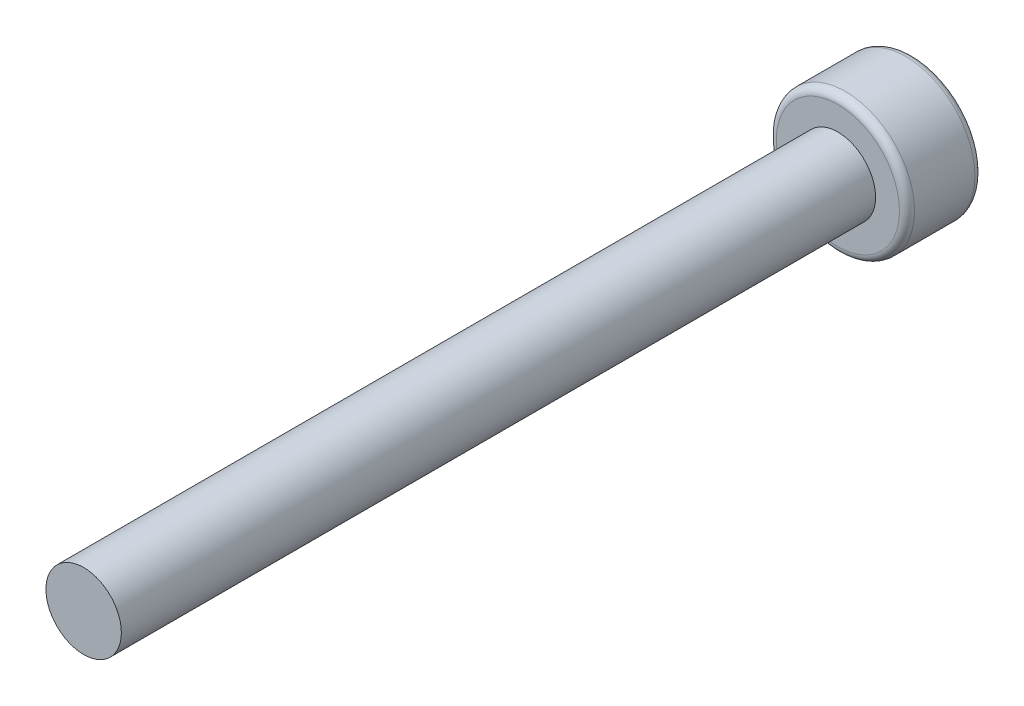
ISO-10303-21;
HEADER;
FILE_DESCRIPTION(('STEP AP214'),'2;1');
FILE_NAME('part.step','',(''),(''),'','','');
FILE_SCHEMA(('AUTOMOTIVE_DESIGN { 1 0 10303 214 1 1 1 1 }'));
ENDSEC;
DATA;
#1=APPLICATION_CONTEXT('core data for automotive mechanical design processes');
#2=APPLICATION_PROTOCOL_DEFINITION('international standard','automotive_design',2000,#1);
#3=PRODUCT_CONTEXT('',#1,'mechanical');
#4=PRODUCT('Part','Part','',(#3));
#5=PRODUCT_RELATED_PRODUCT_CATEGORY('part','',(#4));
#6=PRODUCT_DEFINITION_FORMATION('','',#4);
#7=PRODUCT_DEFINITION_CONTEXT('part definition',#1,'design');
#8=PRODUCT_DEFINITION('design','',#6,#7);
#9=PRODUCT_DEFINITION_SHAPE('','',#8);
#10=(LENGTH_UNIT() NAMED_UNIT(*) SI_UNIT(.MILLI.,.METRE.));
#11=(NAMED_UNIT(*) PLANE_ANGLE_UNIT() SI_UNIT($,.RADIAN.));
#12=(NAMED_UNIT(*) SI_UNIT($,.STERADIAN.) SOLID_ANGLE_UNIT());
#13=UNCERTAINTY_MEASURE_WITH_UNIT(LENGTH_MEASURE(1.E-05),#10,'distance_accuracy_value','');
#14=(GEOMETRIC_REPRESENTATION_CONTEXT(3) GLOBAL_UNCERTAINTY_ASSIGNED_CONTEXT((#13)) GLOBAL_UNIT_ASSIGNED_CONTEXT((#10,
#11,#12)) REPRESENTATION_CONTEXT('',''));
#15=CARTESIAN_POINT('',(0.,0.,0.));
#16=DIRECTION('',(0.,0.,1.));
#17=DIRECTION('',(1.,0.,0.));
#18=AXIS2_PLACEMENT_3D('',#15,#16,#17);
#19=CARTESIAN_POINT('',(0.,0.,3.));
#20=DIRECTION('',(0.,0.,-1.));
#21=DIRECTION('',(-1.,0.,0.));
#22=AXIS2_PLACEMENT_3D('',#19,#20,#21);
#23=CYLINDRICAL_SURFACE('',#22,2.75);
#24=CARTESIAN_POINT('',(0.,0.,0.3));
#25=DIRECTION('',(0.,0.,1.));
#26=DIRECTION('',(1.,0.,0.));
#27=AXIS2_PLACEMENT_3D('',#24,#25,#26);
#28=CIRCLE('',#27,2.75);
#29=CARTESIAN_POINT('',(2.75,0.,0.3));
#30=VERTEX_POINT('',#29);
#31=EDGE_CURVE('E155',#30,#30,#28,.T.);
#32=ORIENTED_EDGE('',*,*,#31,.T.);
#33=EDGE_LOOP('',(#32));
#34=FACE_BOUND('',#33,.T.);
#35=CARTESIAN_POINT('',(0.,0.,2.7));
#36=DIRECTION('',(0.,0.,1.));
#37=DIRECTION('',(1.,0.,0.));
#38=AXIS2_PLACEMENT_3D('',#35,#36,#37);
#39=CIRCLE('',#38,2.75);
#40=CARTESIAN_POINT('',(2.75,0.,2.7));
#41=VERTEX_POINT('',#40);
#42=EDGE_CURVE('E152',#41,#41,#39,.F.);
#43=ORIENTED_EDGE('',*,*,#42,.T.);
#44=EDGE_LOOP('',(#43));
#45=FACE_BOUND('',#44,.T.);
#46=ADVANCED_FACE('F39',(#34,#45),#23,.T.);
#47=CARTESIAN_POINT('',(0.,0.,3.));
#48=DIRECTION('',(0.,0.,1.));
#49=DIRECTION('',(1.,0.,0.));
#50=AXIS2_PLACEMENT_3D('',#47,#48,#49);
#51=PLANE('',#50);
#52=CARTESIAN_POINT('',(0.,0.,3.));
#53=DIRECTION('',(0.,0.,1.));
#54=DIRECTION('',(1.,0.,0.));
#55=AXIS2_PLACEMENT_3D('',#52,#53,#54);
#56=CIRCLE('',#55,2.45);
#57=CARTESIAN_POINT('',(2.45,0.,3.));
#58=VERTEX_POINT('',#57);
#59=EDGE_CURVE('E11',#58,#58,#56,.T.);
#60=ORIENTED_EDGE('',*,*,#59,.T.);
#61=EDGE_LOOP('',(#60));
#62=FACE_BOUND('',#61,.T.);
#63=CARTESIAN_POINT('',(0.,0.,3.));
#64=DIRECTION('',(0.,0.,1.));
#65=DIRECTION('',(1.,0.,0.));
#66=AXIS2_PLACEMENT_3D('',#63,#64,#65);
#67=CIRCLE('',#66,1.5);
#68=CARTESIAN_POINT('',(1.5,0.,3.));
#69=VERTEX_POINT('',#68);
#70=EDGE_CURVE('E149',#69,#69,#67,.T.);
#71=ORIENTED_EDGE('',*,*,#70,.F.);
#72=EDGE_LOOP('',(#71));
#73=FACE_BOUND('',#72,.T.);
#74=ADVANCED_FACE('F170',(#62,#73),#51,.T.);
#75=CARTESIAN_POINT('',(0.,0.,0.));
#76=DIRECTION('',(0.,0.,1.));
#77=DIRECTION('',(1.,0.,0.));
#78=AXIS2_PLACEMENT_3D('',#75,#76,#77);
#79=PLANE('',#78);
#80=DIRECTION('',(0.590811113127551,-0.806809908593706,0.));
#81=VECTOR('',#80,1.);
#82=CARTESIAN_POINT('',(0.820853493075304,1.8624081611757,0.));
#83=LINE('',#82,#81);
#84=CARTESIAN_POINT('',(0.820853493075304,1.8624081611757,0.));
#85=VERTEX_POINT('',#84);
#86=CARTESIAN_POINT('',(2.02331952633127,0.220324102799441,0.));
#87=VERTEX_POINT('',#86);
#88=EDGE_CURVE('E128',#85,#87,#83,.T.);
#89=ORIENTED_EDGE('',*,*,#88,.F.);
#90=DIRECTION('',(0.994123433430926,0.108252478509768,0.));
#91=VECTOR('',#90,1.);
#92=CARTESIAN_POINT('',(-1.20246603325596,1.64208405837626,0.));
#93=LINE('',#92,#91);
#94=CARTESIAN_POINT('',(-1.20246603325596,1.64208405837626,0.));
#95=VERTEX_POINT('',#94);
#96=EDGE_CURVE('E54',#95,#85,#93,.T.);
#97=ORIENTED_EDGE('',*,*,#96,.F.);
#98=DIRECTION('',(0.403312320303375,0.915062387103474,0.));
#99=VECTOR('',#98,1.);
#100=CARTESIAN_POINT('',(-2.02331952633127,-0.220324102799442,0.));
#101=LINE('',#100,#99);
#102=CARTESIAN_POINT('',(-2.02331952633127,-0.220324102799442,0.));
#103=VERTEX_POINT('',#102);
#104=EDGE_CURVE('E137',#103,#95,#101,.T.);
#105=ORIENTED_EDGE('',*,*,#104,.F.);
#106=DIRECTION('',(-0.590811113127551,0.806809908593706,0.));
#107=VECTOR('',#106,1.);
#108=CARTESIAN_POINT('',(-0.820853493075303,-1.8624081611757,0.));
#109=LINE('',#108,#107);
#110=CARTESIAN_POINT('',(-0.820853493075303,-1.8624081611757,0.));
#111=VERTEX_POINT('',#110);
#112=EDGE_CURVE('E135',#111,#103,#109,.T.);
#113=ORIENTED_EDGE('',*,*,#112,.F.);
#114=DIRECTION('',(-0.994123433430926,-0.108252478509768,0.));
#115=VECTOR('',#114,1.);
#116=CARTESIAN_POINT('',(1.20246603325596,-1.64208405837625,0.));
#117=LINE('',#116,#115);
#118=CARTESIAN_POINT('',(1.20246603325596,-1.64208405837625,0.));
#119=VERTEX_POINT('',#118);
#120=EDGE_CURVE('E102',#119,#111,#117,.T.);
#121=ORIENTED_EDGE('',*,*,#120,.F.);
#122=DIRECTION('',(-0.403312320303375,-0.915062387103474,0.));
#123=VECTOR('',#122,1.);
#124=CARTESIAN_POINT('',(2.02331952633127,0.220324102799441,0.));
#125=LINE('',#124,#123);
#126=EDGE_CURVE('E131',#87,#119,#125,.T.);
#127=ORIENTED_EDGE('',*,*,#126,.F.);
#128=EDGE_LOOP('',(#89,#97,#105,#113,#121,#127));
#129=FACE_BOUND('',#128,.T.);
#130=CARTESIAN_POINT('',(0.,0.,0.));
#131=DIRECTION('',(0.,0.,1.));
#132=DIRECTION('',(1.,0.,0.));
#133=AXIS2_PLACEMENT_3D('',#130,#131,#132);
#134=CIRCLE('',#133,2.45);
#135=CARTESIAN_POINT('',(2.45,0.,0.));
#136=VERTEX_POINT('',#135);
#137=EDGE_CURVE('E47',#136,#136,#134,.F.);
#138=ORIENTED_EDGE('',*,*,#137,.T.);
#139=EDGE_LOOP('',(#138));
#140=FACE_BOUND('',#139,.T.);
#141=ADVANCED_FACE('F160',(#129,#140),#79,.F.);
#142=CARTESIAN_POINT('',(0.,0.,33.));
#143=DIRECTION('',(0.,0.,-1.));
#144=DIRECTION('',(-1.,0.,0.));
#145=AXIS2_PLACEMENT_3D('',#142,#143,#144);
#146=CYLINDRICAL_SURFACE('',#145,1.5);
#147=CARTESIAN_POINT('',(0.,0.,33.));
#148=DIRECTION('',(0.,0.,1.));
#149=DIRECTION('',(1.,0.,0.));
#150=AXIS2_PLACEMENT_3D('',#147,#148,#149);
#151=CIRCLE('',#150,1.5);
#152=CARTESIAN_POINT('',(1.5,0.,33.));
#153=VERTEX_POINT('',#152);
#154=EDGE_CURVE('E141',#153,#153,#151,.T.);
#155=ORIENTED_EDGE('',*,*,#154,.F.);
#156=EDGE_LOOP('',(#155));
#157=FACE_BOUND('',#156,.T.);
#158=ORIENTED_EDGE('',*,*,#70,.T.);
#159=EDGE_LOOP('',(#158));
#160=FACE_BOUND('',#159,.T.);
#161=ADVANCED_FACE('F184',(#157,#160),#146,.T.);
#162=CARTESIAN_POINT('',(0.,0.,33.));
#163=DIRECTION('',(0.,0.,1.));
#164=DIRECTION('',(1.,0.,0.));
#165=AXIS2_PLACEMENT_3D('',#162,#163,#164);
#166=PLANE('',#165);
#167=ORIENTED_EDGE('',*,*,#154,.T.);
#168=EDGE_LOOP('',(#167));
#169=FACE_BOUND('',#168,.T.);
#170=ADVANCED_FACE('F165',(#169),#166,.T.);
#171=CARTESIAN_POINT('',(0.,0.,0.3));
#172=DIRECTION('',(0.,0.,1.));
#173=DIRECTION('',(1.,0.,0.));
#174=AXIS2_PLACEMENT_3D('',#171,#172,#173);
#175=TOROIDAL_SURFACE('',#174,2.45,0.3);
#176=ORIENTED_EDGE('',*,*,#137,.F.);
#177=EDGE_LOOP('',(#176));
#178=FACE_BOUND('',#177,.T.);
#179=ORIENTED_EDGE('',*,*,#31,.F.);
#180=EDGE_LOOP('',(#179));
#181=FACE_BOUND('',#180,.T.);
#182=ADVANCED_FACE('F162',(#178,#181),#175,.T.);
#183=CARTESIAN_POINT('',(0.,0.,2.7));
#184=DIRECTION('',(0.,0.,1.));
#185=DIRECTION('',(1.,0.,0.));
#186=AXIS2_PLACEMENT_3D('',#183,#184,#185);
#187=TOROIDAL_SURFACE('',#186,2.45,0.3);
#188=ORIENTED_EDGE('',*,*,#42,.F.);
#189=EDGE_LOOP('',(#188));
#190=FACE_BOUND('',#189,.T.);
#191=ORIENTED_EDGE('',*,*,#59,.F.);
#192=EDGE_LOOP('',(#191));
#193=FACE_BOUND('',#192,.T.);
#194=ADVANCED_FACE('F41',(#190,#193),#187,.T.);
#195=CARTESIAN_POINT('',(-1.20246603325596,1.64208405837626,2.));
#196=DIRECTION('',(-0.108252478509768,0.994123433430926,0.));
#197=DIRECTION('',(-0.994123433430926,-0.108252478509768,0.));
#198=AXIS2_PLACEMENT_3D('',#195,#196,#197);
#199=PLANE('',#198);
#200=ORIENTED_EDGE('',*,*,#96,.T.);
#201=DIRECTION('',(0.,0.,-1.));
#202=VECTOR('',#201,1.);
#203=CARTESIAN_POINT('',(0.820853493075304,1.8624081611757,2.));
#204=LINE('',#203,#202);
#205=CARTESIAN_POINT('',(0.820853493075304,1.8624081611757,2.));
#206=VERTEX_POINT('',#205);
#207=EDGE_CURVE('E84',#206,#85,#204,.T.);
#208=ORIENTED_EDGE('',*,*,#207,.F.);
#209=DIRECTION('',(0.994123433430926,0.108252478509768,0.));
#210=VECTOR('',#209,1.);
#211=CARTESIAN_POINT('',(-1.20246603325596,1.64208405837626,2.));
#212=LINE('',#211,#210);
#213=CARTESIAN_POINT('',(-1.20246603325596,1.64208405837626,2.));
#214=VERTEX_POINT('',#213);
#215=EDGE_CURVE('E139',#214,#206,#212,.T.);
#216=ORIENTED_EDGE('',*,*,#215,.F.);
#217=DIRECTION('',(0.,0.,-1.));
#218=VECTOR('',#217,1.);
#219=CARTESIAN_POINT('',(-1.20246603325596,1.64208405837626,2.));
#220=LINE('',#219,#218);
#221=EDGE_CURVE('E62',#214,#95,#220,.T.);
#222=ORIENTED_EDGE('',*,*,#221,.T.);
#223=EDGE_LOOP('',(#200,#208,#216,#222));
#224=FACE_BOUND('',#223,.T.);
#225=ADVANCED_FACE('F176',(#224),#199,.F.);
#226=CARTESIAN_POINT('',(-2.02331952633127,-0.220324102799442,2.));
#227=DIRECTION('',(-0.915062387103474,0.403312320303375,0.));
#228=DIRECTION('',(-0.403312320303375,-0.915062387103474,0.));
#229=AXIS2_PLACEMENT_3D('',#226,#227,#228);
#230=PLANE('',#229);
#231=ORIENTED_EDGE('',*,*,#104,.T.);
#232=ORIENTED_EDGE('',*,*,#221,.F.);
#233=DIRECTION('',(0.403312320303375,0.915062387103474,0.));
#234=VECTOR('',#233,1.);
#235=CARTESIAN_POINT('',(-2.02331952633127,-0.220324102799442,2.));
#236=LINE('',#235,#234);
#237=CARTESIAN_POINT('',(-2.02331952633127,-0.220324102799442,2.));
#238=VERTEX_POINT('',#237);
#239=EDGE_CURVE('E114',#238,#214,#236,.T.);
#240=ORIENTED_EDGE('',*,*,#239,.F.);
#241=DIRECTION('',(0.,0.,-1.));
#242=VECTOR('',#241,1.);
#243=CARTESIAN_POINT('',(-2.02331952633127,-0.220324102799442,2.));
#244=LINE('',#243,#242);
#245=EDGE_CURVE('E106',#238,#103,#244,.T.);
#246=ORIENTED_EDGE('',*,*,#245,.T.);
#247=EDGE_LOOP('',(#231,#232,#240,#246));
#248=FACE_BOUND('',#247,.T.);
#249=ADVANCED_FACE('F200',(#248),#230,.F.);
#250=CARTESIAN_POINT('',(-0.820853493075303,-1.8624081611757,2.));
#251=DIRECTION('',(-0.806809908593706,-0.590811113127551,0.));
#252=DIRECTION('',(0.590811113127551,-0.806809908593706,0.));
#253=AXIS2_PLACEMENT_3D('',#250,#251,#252);
#254=PLANE('',#253);
#255=ORIENTED_EDGE('',*,*,#112,.T.);
#256=ORIENTED_EDGE('',*,*,#245,.F.);
#257=DIRECTION('',(-0.590811113127551,0.806809908593706,0.));
#258=VECTOR('',#257,1.);
#259=CARTESIAN_POINT('',(-0.820853493075303,-1.8624081611757,2.));
#260=LINE('',#259,#258);
#261=CARTESIAN_POINT('',(-0.820853493075303,-1.8624081611757,2.));
#262=VERTEX_POINT('',#261);
#263=EDGE_CURVE('E110',#262,#238,#260,.T.);
#264=ORIENTED_EDGE('',*,*,#263,.F.);
#265=DIRECTION('',(0.,0.,-1.));
#266=VECTOR('',#265,1.);
#267=CARTESIAN_POINT('',(-0.820853493075303,-1.8624081611757,2.));
#268=LINE('',#267,#266);
#269=EDGE_CURVE('E95',#262,#111,#268,.T.);
#270=ORIENTED_EDGE('',*,*,#269,.T.);
#271=EDGE_LOOP('',(#255,#256,#264,#270));
#272=FACE_BOUND('',#271,.T.);
#273=ADVANCED_FACE('F111',(#272),#254,.F.);
#274=CARTESIAN_POINT('',(1.20246603325596,-1.64208405837625,2.));
#275=DIRECTION('',(0.108252478509768,-0.994123433430926,0.));
#276=DIRECTION('',(0.994123433430926,0.108252478509768,0.));
#277=AXIS2_PLACEMENT_3D('',#274,#275,#276);
#278=PLANE('',#277);
#279=ORIENTED_EDGE('',*,*,#120,.T.);
#280=ORIENTED_EDGE('',*,*,#269,.F.);
#281=DIRECTION('',(-0.994123433430926,-0.108252478509768,0.));
#282=VECTOR('',#281,1.);
#283=CARTESIAN_POINT('',(1.20246603325596,-1.64208405837625,2.));
#284=LINE('',#283,#282);
#285=CARTESIAN_POINT('',(1.20246603325596,-1.64208405837625,2.));
#286=VERTEX_POINT('',#285);
#287=EDGE_CURVE('E99',#286,#262,#284,.T.);
#288=ORIENTED_EDGE('',*,*,#287,.F.);
#289=DIRECTION('',(0.,0.,-1.));
#290=VECTOR('',#289,1.);
#291=CARTESIAN_POINT('',(1.20246603325596,-1.64208405837625,2.));
#292=LINE('',#291,#290);
#293=EDGE_CURVE('E107',#286,#119,#292,.T.);
#294=ORIENTED_EDGE('',*,*,#293,.T.);
#295=EDGE_LOOP('',(#279,#280,#288,#294));
#296=FACE_BOUND('',#295,.T.);
#297=ADVANCED_FACE('F97',(#296),#278,.F.);
#298=CARTESIAN_POINT('',(2.02331952633127,0.220324102799441,2.));
#299=DIRECTION('',(0.915062387103474,-0.403312320303375,0.));
#300=DIRECTION('',(0.403312320303375,0.915062387103474,0.));
#301=AXIS2_PLACEMENT_3D('',#298,#299,#300);
#302=PLANE('',#301);
#303=ORIENTED_EDGE('',*,*,#126,.T.);
#304=ORIENTED_EDGE('',*,*,#293,.F.);
#305=DIRECTION('',(-0.403312320303375,-0.915062387103474,0.));
#306=VECTOR('',#305,1.);
#307=CARTESIAN_POINT('',(2.02331952633127,0.220324102799441,2.));
#308=LINE('',#307,#306);
#309=CARTESIAN_POINT('',(2.02331952633127,0.220324102799441,2.));
#310=VERTEX_POINT('',#309);
#311=EDGE_CURVE('E120',#310,#286,#308,.T.);
#312=ORIENTED_EDGE('',*,*,#311,.F.);
#313=DIRECTION('',(0.,0.,-1.));
#314=VECTOR('',#313,1.);
#315=CARTESIAN_POINT('',(2.02331952633127,0.220324102799441,2.));
#316=LINE('',#315,#314);
#317=EDGE_CURVE('E144',#310,#87,#316,.T.);
#318=ORIENTED_EDGE('',*,*,#317,.T.);
#319=EDGE_LOOP('',(#303,#304,#312,#318));
#320=FACE_BOUND('',#319,.T.);
#321=ADVANCED_FACE('F204',(#320),#302,.F.);
#322=CARTESIAN_POINT('',(0.820853493075304,1.8624081611757,2.));
#323=DIRECTION('',(0.806809908593706,0.590811113127551,0.));
#324=DIRECTION('',(-0.590811113127551,0.806809908593706,0.));
#325=AXIS2_PLACEMENT_3D('',#322,#323,#324);
#326=PLANE('',#325);
#327=ORIENTED_EDGE('',*,*,#88,.T.);
#328=ORIENTED_EDGE('',*,*,#317,.F.);
#329=DIRECTION('',(0.590811113127551,-0.806809908593706,0.));
#330=VECTOR('',#329,1.);
#331=CARTESIAN_POINT('',(0.820853493075304,1.8624081611757,2.));
#332=LINE('',#331,#330);
#333=EDGE_CURVE('E122',#206,#310,#332,.T.);
#334=ORIENTED_EDGE('',*,*,#333,.F.);
#335=ORIENTED_EDGE('',*,*,#207,.T.);
#336=EDGE_LOOP('',(#327,#328,#334,#335));
#337=FACE_BOUND('',#336,.T.);
#338=ADVANCED_FACE('F201',(#337),#326,.F.);
#339=CARTESIAN_POINT('',(0.,0.,2.));
#340=DIRECTION('',(0.,0.,-1.));
#341=DIRECTION('',(-1.,0.,0.));
#342=AXIS2_PLACEMENT_3D('',#339,#340,#341);
#343=PLANE('',#342);
#344=ORIENTED_EDGE('',*,*,#215,.T.);
#345=ORIENTED_EDGE('',*,*,#333,.T.);
#346=ORIENTED_EDGE('',*,*,#311,.T.);
#347=ORIENTED_EDGE('',*,*,#287,.T.);
#348=ORIENTED_EDGE('',*,*,#263,.T.);
#349=ORIENTED_EDGE('',*,*,#239,.T.);
#350=EDGE_LOOP('',(#344,#345,#346,#347,#348,#349));
#351=FACE_BOUND('',#350,.T.);
#352=ADVANCED_FACE('F117',(#351),#343,.T.);
#353=CLOSED_SHELL('',(#46,#74,#141,#161,#170,#182,#194,#225,#249,#273,#297,#321,#338,#352));
#354=MANIFOLD_SOLID_BREP('B2',#353);
#355=ADVANCED_BREP_SHAPE_REPRESENTATION('',(#18,#354),#14);
#356=SHAPE_DEFINITION_REPRESENTATION(#9,#355);
ENDSEC;
END-ISO-10303-21;
